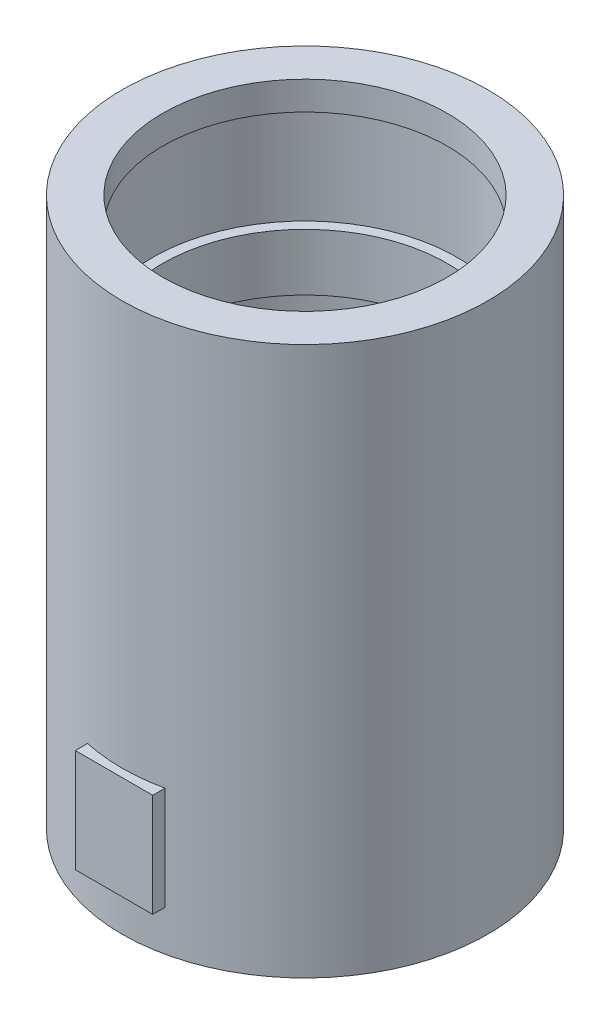
ISO-10303-21;
HEADER;
FILE_DESCRIPTION(('STEP AP214'),'2;1');
FILE_NAME('part.step','',(''),(''),'','','');
FILE_SCHEMA(('AUTOMOTIVE_DESIGN { 1 0 10303 214 1 1 1 1 }'));
ENDSEC;
DATA;
#1=APPLICATION_CONTEXT('core data for automotive mechanical design processes');
#2=APPLICATION_PROTOCOL_DEFINITION('international standard','automotive_design',2000,#1);
#3=PRODUCT_CONTEXT('',#1,'mechanical');
#4=PRODUCT('Part','Part','',(#3));
#5=PRODUCT_RELATED_PRODUCT_CATEGORY('part','',(#4));
#6=PRODUCT_DEFINITION_FORMATION('','',#4);
#7=PRODUCT_DEFINITION_CONTEXT('part definition',#1,'design');
#8=PRODUCT_DEFINITION('design','',#6,#7);
#9=PRODUCT_DEFINITION_SHAPE('','',#8);
#10=(LENGTH_UNIT() NAMED_UNIT(*) SI_UNIT(.MILLI.,.METRE.));
#11=(NAMED_UNIT(*) PLANE_ANGLE_UNIT() SI_UNIT($,.RADIAN.));
#12=(NAMED_UNIT(*) SI_UNIT($,.STERADIAN.) SOLID_ANGLE_UNIT());
#13=UNCERTAINTY_MEASURE_WITH_UNIT(LENGTH_MEASURE(1.E-05),#10,'distance_accuracy_value','');
#14=(GEOMETRIC_REPRESENTATION_CONTEXT(3) GLOBAL_UNCERTAINTY_ASSIGNED_CONTEXT((#13)) GLOBAL_UNIT_ASSIGNED_CONTEXT((#10,
#11,#12)) REPRESENTATION_CONTEXT('',''));
#15=CARTESIAN_POINT('',(0.,0.,0.));
#16=DIRECTION('',(0.,0.,1.));
#17=DIRECTION('',(1.,0.,0.));
#18=AXIS2_PLACEMENT_3D('',#15,#16,#17);
#19=CARTESIAN_POINT('',(0.,135.,0.));
#20=DIRECTION('',(0.,-1.,0.));
#21=DIRECTION('',(0.,0.,-1.));
#22=AXIS2_PLACEMENT_3D('',#19,#20,#21);
#23=CYLINDRICAL_SURFACE('',#22,45.);
#24=CARTESIAN_POINT('',(0.,10.,0.));
#25=DIRECTION('',(0.,-1.,0.));
#26=DIRECTION('',(1.,0.,0.));
#27=AXIS2_PLACEMENT_3D('',#24,#25,#26);
#28=CIRCLE('',#27,45.);
#29=CARTESIAN_POINT('',(9.525,10.,43.9803862534198));
#30=VERTEX_POINT('',#29);
#31=CARTESIAN_POINT('',(-9.525,10.,43.9803862534198));
#32=VERTEX_POINT('',#31);
#33=EDGE_CURVE('E145',#30,#32,#28,.T.);
#34=ORIENTED_EDGE('',*,*,#33,.T.);
#35=DIRECTION('',(0.,-1.,0.));
#36=VECTOR('',#35,1.);
#37=CARTESIAN_POINT('',(-9.525,135.,43.9803862534198));
#38=LINE('',#37,#36);
#39=CARTESIAN_POINT('',(-9.525,35.4,43.9803862534198));
#40=VERTEX_POINT('',#39);
#41=EDGE_CURVE('E11',#32,#40,#38,.F.);
#42=ORIENTED_EDGE('',*,*,#41,.T.);
#43=CARTESIAN_POINT('',(0.,35.4,0.));
#44=DIRECTION('',(0.,1.,0.));
#45=DIRECTION('',(0.,0.,1.));
#46=AXIS2_PLACEMENT_3D('',#43,#44,#45);
#47=CIRCLE('',#46,45.);
#48=CARTESIAN_POINT('',(9.525,35.4,43.9803862534198));
#49=VERTEX_POINT('',#48);
#50=EDGE_CURVE('E45',#40,#49,#47,.T.);
#51=ORIENTED_EDGE('',*,*,#50,.T.);
#52=DIRECTION('',(0.,-1.,0.));
#53=VECTOR('',#52,1.);
#54=CARTESIAN_POINT('',(9.525,135.,43.9803862534198));
#55=LINE('',#54,#53);
#56=EDGE_CURVE('E149',#49,#30,#55,.T.);
#57=ORIENTED_EDGE('',*,*,#56,.T.);
#58=EDGE_LOOP('',(#34,#42,#51,#57));
#59=FACE_BOUND('',#58,.T.);
#60=CARTESIAN_POINT('',(0.,135.,0.));
#61=DIRECTION('',(0.,1.,0.));
#62=DIRECTION('',(0.,0.,1.));
#63=AXIS2_PLACEMENT_3D('',#60,#61,#62);
#64=CIRCLE('',#63,45.);
#65=CARTESIAN_POINT('',(0.,135.,45.));
#66=VERTEX_POINT('',#65);
#67=EDGE_CURVE('E142',#66,#66,#64,.T.);
#68=ORIENTED_EDGE('',*,*,#67,.F.);
#69=EDGE_LOOP('',(#68));
#70=FACE_BOUND('',#69,.T.);
#71=CARTESIAN_POINT('',(0.,0.,0.));
#72=DIRECTION('',(0.,1.,0.));
#73=DIRECTION('',(0.,0.,1.));
#74=AXIS2_PLACEMENT_3D('',#71,#72,#73);
#75=CIRCLE('',#74,45.);
#76=CARTESIAN_POINT('',(0.,0.,45.));
#77=VERTEX_POINT('',#76);
#78=EDGE_CURVE('E139',#77,#77,#75,.T.);
#79=ORIENTED_EDGE('',*,*,#78,.T.);
#80=EDGE_LOOP('',(#79));
#81=FACE_BOUND('',#80,.T.);
#82=ADVANCED_FACE('F38',(#59,#70,#81),#23,.T.);
#83=CARTESIAN_POINT('',(0.,135.,0.));
#84=DIRECTION('',(0.,1.,0.));
#85=DIRECTION('',(0.,0.,1.));
#86=AXIS2_PLACEMENT_3D('',#83,#84,#85);
#87=PLANE('',#86);
#88=CARTESIAN_POINT('',(0.,135.,0.));
#89=DIRECTION('',(0.,1.,0.));
#90=DIRECTION('',(0.,0.,1.));
#91=AXIS2_PLACEMENT_3D('',#88,#89,#90);
#92=CIRCLE('',#91,35.);
#93=CARTESIAN_POINT('',(0.,135.,35.));
#94=VERTEX_POINT('',#93);
#95=EDGE_CURVE('E133',#94,#94,#92,.T.);
#96=ORIENTED_EDGE('',*,*,#95,.F.);
#97=EDGE_LOOP('',(#96));
#98=FACE_BOUND('',#97,.T.);
#99=ORIENTED_EDGE('',*,*,#67,.T.);
#100=EDGE_LOOP('',(#99));
#101=FACE_BOUND('',#100,.T.);
#102=ADVANCED_FACE('F166',(#98,#101),#87,.T.);
#103=CARTESIAN_POINT('',(0.,0.,0.));
#104=DIRECTION('',(0.,1.,0.));
#105=DIRECTION('',(0.,0.,1.));
#106=AXIS2_PLACEMENT_3D('',#103,#104,#105);
#107=PLANE('',#106);
#108=ORIENTED_EDGE('',*,*,#78,.F.);
#109=EDGE_LOOP('',(#108));
#110=FACE_BOUND('',#109,.T.);
#111=ADVANCED_FACE('F170',(#110),#107,.F.);
#112=CARTESIAN_POINT('',(0.,45.,0.));
#113=DIRECTION('',(0.,1.,0.));
#114=DIRECTION('',(0.,0.,1.));
#115=AXIS2_PLACEMENT_3D('',#112,#113,#114);
#116=CYLINDRICAL_SURFACE('',#115,35.);
#117=CARTESIAN_POINT('',(0.,128.,0.));
#118=DIRECTION('',(0.,1.,0.));
#119=DIRECTION('',(0.,0.,1.));
#120=AXIS2_PLACEMENT_3D('',#117,#118,#119);
#121=CIRCLE('',#120,35.);
#122=CARTESIAN_POINT('',(0.,128.,35.));
#123=VERTEX_POINT('',#122);
#124=EDGE_CURVE('E121',#123,#123,#121,.T.);
#125=CARTESIAN_POINT('',(0.,128.,35.));
#126=CARTESIAN_POINT('',(0.,128.072916666667,35.));
#127=CARTESIAN_POINT('',(0.,128.145833333333,35.));
#128=CARTESIAN_POINT('',(0.,128.291666666667,35.));
#129=CARTESIAN_POINT('',(0.,128.364583333333,35.));
#130=CARTESIAN_POINT('',(0.,128.510416666667,35.));
#131=CARTESIAN_POINT('',(0.,128.583333333333,35.));
#132=CARTESIAN_POINT('',(0.,128.729166666667,35.));
#133=CARTESIAN_POINT('',(0.,128.802083333333,35.));
#134=CARTESIAN_POINT('',(0.,128.947916666667,35.));
#135=CARTESIAN_POINT('',(0.,129.020833333333,35.));
#136=CARTESIAN_POINT('',(0.,129.166666666667,35.));
#137=CARTESIAN_POINT('',(0.,129.239583333333,35.));
#138=CARTESIAN_POINT('',(0.,129.385416666667,35.));
#139=CARTESIAN_POINT('',(0.,129.458333333333,35.));
#140=CARTESIAN_POINT('',(0.,129.604166666667,35.));
#141=CARTESIAN_POINT('',(0.,129.677083333333,35.));
#142=CARTESIAN_POINT('',(0.,129.822916666667,35.));
#143=CARTESIAN_POINT('',(0.,129.895833333333,35.));
#144=CARTESIAN_POINT('',(0.,130.041666666667,35.));
#145=CARTESIAN_POINT('',(0.,130.114583333333,35.));
#146=CARTESIAN_POINT('',(0.,130.260416666667,35.));
#147=CARTESIAN_POINT('',(0.,130.333333333333,35.));
#148=CARTESIAN_POINT('',(0.,130.479166666667,35.));
#149=CARTESIAN_POINT('',(0.,130.552083333333,35.));
#150=CARTESIAN_POINT('',(0.,130.697916666667,35.));
#151=CARTESIAN_POINT('',(0.,130.770833333333,35.));
#152=CARTESIAN_POINT('',(0.,130.916666666667,35.));
#153=CARTESIAN_POINT('',(0.,130.989583333333,35.));
#154=CARTESIAN_POINT('',(0.,131.135416666667,35.));
#155=CARTESIAN_POINT('',(0.,131.208333333333,35.));
#156=CARTESIAN_POINT('',(0.,131.354166666667,35.));
#157=CARTESIAN_POINT('',(0.,131.427083333333,35.));
#158=CARTESIAN_POINT('',(0.,131.572916666667,35.));
#159=CARTESIAN_POINT('',(0.,131.645833333333,35.));
#160=CARTESIAN_POINT('',(0.,131.791666666667,35.));
#161=CARTESIAN_POINT('',(0.,131.864583333333,35.));
#162=CARTESIAN_POINT('',(0.,132.010416666667,35.));
#163=CARTESIAN_POINT('',(0.,132.083333333333,35.));
#164=CARTESIAN_POINT('',(0.,132.229166666667,35.));
#165=CARTESIAN_POINT('',(0.,132.302083333333,35.));
#166=CARTESIAN_POINT('',(0.,132.447916666667,35.));
#167=CARTESIAN_POINT('',(0.,132.520833333333,35.));
#168=CARTESIAN_POINT('',(0.,132.666666666667,35.));
#169=CARTESIAN_POINT('',(0.,132.739583333333,35.));
#170=CARTESIAN_POINT('',(0.,132.885416666667,35.));
#171=CARTESIAN_POINT('',(0.,132.958333333333,35.));
#172=CARTESIAN_POINT('',(0.,133.104166666667,35.));
#173=CARTESIAN_POINT('',(0.,133.177083333333,35.));
#174=CARTESIAN_POINT('',(0.,133.322916666667,35.));
#175=CARTESIAN_POINT('',(0.,133.395833333333,35.));
#176=CARTESIAN_POINT('',(0.,133.541666666667,35.));
#177=CARTESIAN_POINT('',(0.,133.614583333333,35.));
#178=CARTESIAN_POINT('',(0.,133.760416666667,35.));
#179=CARTESIAN_POINT('',(0.,133.833333333333,35.));
#180=CARTESIAN_POINT('',(0.,133.979166666667,35.));
#181=CARTESIAN_POINT('',(0.,134.052083333333,35.));
#182=CARTESIAN_POINT('',(0.,134.197916666667,35.));
#183=CARTESIAN_POINT('',(0.,134.270833333333,35.));
#184=CARTESIAN_POINT('',(0.,134.416666666667,35.));
#185=CARTESIAN_POINT('',(0.,134.489583333333,35.));
#186=CARTESIAN_POINT('',(0.,134.635416666667,35.));
#187=CARTESIAN_POINT('',(0.,134.708333333333,35.));
#188=CARTESIAN_POINT('',(0.,134.854166666667,35.));
#189=CARTESIAN_POINT('',(0.,134.927083333333,35.));
#190=CARTESIAN_POINT('',(0.,135.,35.));
#191=B_SPLINE_CURVE_WITH_KNOTS('',3,(#125,#126,#127,#128,#129,#130,#131,#132,#133,#134,#135,
#136,#137,#138,#139,#140,#141,#142,#143,#144,#145,#146,#147,#148,#149,#150,#151,#152,#153,#154,
#155,#156,#157,#158,#159,#160,#161,#162,#163,#164,#165,#166,#167,#168,#169,#170,#171,#172,#173,
#174,#175,#176,#177,#178,#179,#180,#181,#182,#183,#184,#185,#186,#187,#188,#189,#190),
.UNSPECIFIED.,.F.,.F.,(4,2,2,2,2,2,2,2,2,2,2,2,2,2,2,2,2,2,2,2,2,2,2,2,2,2,2,2,2,2,2,2,4),(0.,
0.21874999999999,0.43749999999998,0.656249999999969,0.874999999999987,1.09375,1.31249999999999,
1.53124999999998,1.74999999999997,1.96874999999999,2.18750000000001,2.40625,2.62499999999999,
2.84374999999998,3.06249999999997,3.28124999999999,3.5,3.71874999999999,3.93749999999998,
4.15624999999997,4.37499999999999,4.59375000000001,4.8125,5.03124999999999,5.24999999999998,
5.46874999999999,5.68750000000001,5.90625,6.12499999999999,6.34374999999998,6.56249999999997,
6.78124999999999,7.00000000000001),.UNSPECIFIED.);
#192=EDGE_CURVE('BSEAM176',#123,#94,#191,.T.);
#193=ORIENTED_EDGE('',*,*,#124,.F.);
#194=ORIENTED_EDGE('',*,*,#95,.T.);
#195=ORIENTED_EDGE('',*,*,#192,.T.);
#196=ORIENTED_EDGE('',*,*,#192,.F.);
#197=EDGE_LOOP('',(#193,#195,#194,#196));
#198=FACE_BOUND('',#197,.T.);
#199=ADVANCED_FACE('F176',(#198),#116,.F.);
#200=CARTESIAN_POINT('',(0.,103.,0.));
#201=DIRECTION('',(0.,1.,0.));
#202=DIRECTION('',(0.,0.,1.));
#203=AXIS2_PLACEMENT_3D('',#200,#201,#202);
#204=CYLINDRICAL_SURFACE('',#203,37.5);
#205=CARTESIAN_POINT('',(0.,103.,0.));
#206=DIRECTION('',(0.,1.,0.));
#207=DIRECTION('',(0.,0.,1.));
#208=AXIS2_PLACEMENT_3D('',#205,#206,#207);
#209=CIRCLE('',#208,37.5);
#210=CARTESIAN_POINT('',(0.,103.,37.5));
#211=VERTEX_POINT('',#210);
#212=EDGE_CURVE('E130',#211,#211,#209,.T.);
#213=ORIENTED_EDGE('',*,*,#212,.F.);
#214=EDGE_LOOP('',(#213));
#215=FACE_BOUND('',#214,.T.);
#216=CARTESIAN_POINT('',(0.,128.,0.));
#217=DIRECTION('',(0.,1.,0.));
#218=DIRECTION('',(0.,0.,1.));
#219=AXIS2_PLACEMENT_3D('',#216,#217,#218);
#220=CIRCLE('',#219,37.5);
#221=CARTESIAN_POINT('',(0.,128.,37.5));
#222=VERTEX_POINT('',#221);
#223=EDGE_CURVE('E127',#222,#222,#220,.T.);
#224=ORIENTED_EDGE('',*,*,#223,.T.);
#225=EDGE_LOOP('',(#224));
#226=FACE_BOUND('',#225,.T.);
#227=ADVANCED_FACE('F183',(#215,#226),#204,.F.);
#228=CARTESIAN_POINT('',(0.,103.,0.));
#229=DIRECTION('',(0.,1.,0.));
#230=DIRECTION('',(0.,0.,1.));
#231=AXIS2_PLACEMENT_3D('',#228,#229,#230);
#232=PLANE('',#231);
#233=CARTESIAN_POINT('',(0.,103.,0.));
#234=DIRECTION('',(0.,1.,0.));
#235=DIRECTION('',(0.,0.,1.));
#236=AXIS2_PLACEMENT_3D('',#233,#234,#235);
#237=CIRCLE('',#236,35.);
#238=CARTESIAN_POINT('',(0.,103.,35.));
#239=VERTEX_POINT('',#238);
#240=EDGE_CURVE('E124',#239,#239,#237,.T.);
#241=ORIENTED_EDGE('',*,*,#240,.F.);
#242=EDGE_LOOP('',(#241));
#243=FACE_BOUND('',#242,.T.);
#244=ORIENTED_EDGE('',*,*,#212,.T.);
#245=EDGE_LOOP('',(#244));
#246=FACE_BOUND('',#245,.T.);
#247=ADVANCED_FACE('F194',(#243,#246),#232,.T.);
#248=CARTESIAN_POINT('',(0.,128.,0.));
#249=DIRECTION('',(0.,1.,0.));
#250=DIRECTION('',(0.,0.,1.));
#251=AXIS2_PLACEMENT_3D('',#248,#249,#250);
#252=PLANE('',#251);
#253=ORIENTED_EDGE('',*,*,#124,.T.);
#254=EDGE_LOOP('',(#253));
#255=FACE_BOUND('',#254,.T.);
#256=ORIENTED_EDGE('',*,*,#223,.F.);
#257=EDGE_LOOP('',(#256));
#258=FACE_BOUND('',#257,.T.);
#259=ADVANCED_FACE('F196',(#255,#258),#252,.F.);
#260=CARTESIAN_POINT('',(0.,89.,0.));
#261=DIRECTION('',(0.,1.,0.));
#262=DIRECTION('',(0.,0.,1.));
#263=AXIS2_PLACEMENT_3D('',#260,#261,#262);
#264=CIRCLE('',#263,35.);
#265=CARTESIAN_POINT('',(0.,89.,35.));
#266=VERTEX_POINT('',#265);
#267=EDGE_CURVE('E109',#266,#266,#264,.T.);
#268=CARTESIAN_POINT('',(0.,89.,35.));
#269=CARTESIAN_POINT('',(0.,89.1458333333333,35.));
#270=CARTESIAN_POINT('',(0.,89.2916666666667,35.));
#271=CARTESIAN_POINT('',(0.,89.5833333333333,35.));
#272=CARTESIAN_POINT('',(0.,89.7291666666667,35.));
#273=CARTESIAN_POINT('',(0.,90.0208333333333,35.));
#274=CARTESIAN_POINT('',(0.,90.1666666666667,35.));
#275=CARTESIAN_POINT('',(0.,90.4583333333333,35.));
#276=CARTESIAN_POINT('',(0.,90.6041666666667,35.));
#277=CARTESIAN_POINT('',(0.,90.8958333333333,35.));
#278=CARTESIAN_POINT('',(0.,91.0416666666667,35.));
#279=CARTESIAN_POINT('',(0.,91.3333333333333,35.));
#280=CARTESIAN_POINT('',(0.,91.4791666666667,35.));
#281=CARTESIAN_POINT('',(0.,91.7708333333333,35.));
#282=CARTESIAN_POINT('',(0.,91.9166666666667,35.));
#283=CARTESIAN_POINT('',(0.,92.2083333333333,35.));
#284=CARTESIAN_POINT('',(0.,92.3541666666667,35.));
#285=CARTESIAN_POINT('',(0.,92.6458333333333,35.));
#286=CARTESIAN_POINT('',(0.,92.7916666666667,35.));
#287=CARTESIAN_POINT('',(0.,93.0833333333333,35.));
#288=CARTESIAN_POINT('',(0.,93.2291666666667,35.));
#289=CARTESIAN_POINT('',(0.,93.5208333333333,35.));
#290=CARTESIAN_POINT('',(0.,93.6666666666667,35.));
#291=CARTESIAN_POINT('',(0.,93.9583333333333,35.));
#292=CARTESIAN_POINT('',(0.,94.1041666666667,35.));
#293=CARTESIAN_POINT('',(0.,94.3958333333333,35.));
#294=CARTESIAN_POINT('',(0.,94.5416666666667,35.));
#295=CARTESIAN_POINT('',(0.,94.8333333333333,35.));
#296=CARTESIAN_POINT('',(0.,94.9791666666667,35.));
#297=CARTESIAN_POINT('',(0.,95.2708333333333,35.));
#298=CARTESIAN_POINT('',(0.,95.4166666666667,35.));
#299=CARTESIAN_POINT('',(0.,95.7083333333333,35.));
#300=CARTESIAN_POINT('',(0.,95.8541666666667,35.));
#301=CARTESIAN_POINT('',(0.,96.1458333333333,35.));
#302=CARTESIAN_POINT('',(0.,96.2916666666667,35.));
#303=CARTESIAN_POINT('',(0.,96.5833333333333,35.));
#304=CARTESIAN_POINT('',(0.,96.7291666666667,35.));
#305=CARTESIAN_POINT('',(0.,97.0208333333333,35.));
#306=CARTESIAN_POINT('',(0.,97.1666666666667,35.));
#307=CARTESIAN_POINT('',(0.,97.4583333333333,35.));
#308=CARTESIAN_POINT('',(0.,97.6041666666667,35.));
#309=CARTESIAN_POINT('',(0.,97.8958333333333,35.));
#310=CARTESIAN_POINT('',(0.,98.0416666666667,35.));
#311=CARTESIAN_POINT('',(0.,98.3333333333333,35.));
#312=CARTESIAN_POINT('',(0.,98.4791666666667,35.));
#313=CARTESIAN_POINT('',(0.,98.7708333333333,35.));
#314=CARTESIAN_POINT('',(0.,98.9166666666667,35.));
#315=CARTESIAN_POINT('',(0.,99.2083333333333,35.));
#316=CARTESIAN_POINT('',(0.,99.3541666666667,35.));
#317=CARTESIAN_POINT('',(0.,99.6458333333333,35.));
#318=CARTESIAN_POINT('',(0.,99.7916666666667,35.));
#319=CARTESIAN_POINT('',(0.,100.083333333333,35.));
#320=CARTESIAN_POINT('',(0.,100.229166666667,35.));
#321=CARTESIAN_POINT('',(0.,100.520833333333,35.));
#322=CARTESIAN_POINT('',(0.,100.666666666667,35.));
#323=CARTESIAN_POINT('',(0.,100.958333333333,35.));
#324=CARTESIAN_POINT('',(0.,101.104166666667,35.));
#325=CARTESIAN_POINT('',(0.,101.395833333333,35.));
#326=CARTESIAN_POINT('',(0.,101.541666666667,35.));
#327=CARTESIAN_POINT('',(0.,101.833333333333,35.));
#328=CARTESIAN_POINT('',(0.,101.979166666667,35.));
#329=CARTESIAN_POINT('',(0.,102.270833333333,35.));
#330=CARTESIAN_POINT('',(0.,102.416666666667,35.));
#331=CARTESIAN_POINT('',(0.,102.708333333333,35.));
#332=CARTESIAN_POINT('',(0.,102.854166666667,35.));
#333=CARTESIAN_POINT('',(0.,103.,35.));
#334=B_SPLINE_CURVE_WITH_KNOTS('',3,(#268,#269,#270,#271,#272,#273,#274,#275,#276,#277,#278,
#279,#280,#281,#282,#283,#284,#285,#286,#287,#288,#289,#290,#291,#292,#293,#294,#295,#296,#297,
#298,#299,#300,#301,#302,#303,#304,#305,#306,#307,#308,#309,#310,#311,#312,#313,#314,#315,#316,
#317,#318,#319,#320,#321,#322,#323,#324,#325,#326,#327,#328,#329,#330,#331,#332,#333),
.UNSPECIFIED.,.F.,.F.,(4,2,2,2,2,2,2,2,2,2,2,2,2,2,2,2,2,2,2,2,2,2,2,2,2,2,2,2,2,2,2,2,4),(0.,
0.437500000000007,0.875000000000015,1.31250000000001,1.75,2.18750000000001,2.62500000000002,
3.06250000000001,3.5,3.93750000000001,4.375,4.8125,5.25,5.68750000000001,6.12500000000001,
6.5625,7.00000000000001,7.43750000000001,7.87500000000001,8.3125,8.75000000000001,
9.18750000000001,9.62499999999999,10.0625,10.5,10.9375,11.375,11.8125,12.25,12.6875,13.125,
13.5625,14.),.UNSPECIFIED.);
#335=EDGE_CURVE('BSEAM186',#266,#239,#334,.T.);
#336=ORIENTED_EDGE('',*,*,#267,.F.);
#337=ORIENTED_EDGE('',*,*,#240,.T.);
#338=ORIENTED_EDGE('',*,*,#335,.T.);
#339=ORIENTED_EDGE('',*,*,#335,.F.);
#340=EDGE_LOOP('',(#336,#338,#337,#339));
#341=FACE_BOUND('',#340,.T.);
#342=ADVANCED_FACE('F186',(#341),#116,.F.);
#343=CARTESIAN_POINT('',(0.,64.,0.));
#344=DIRECTION('',(0.,1.,0.));
#345=DIRECTION('',(0.,0.,1.));
#346=AXIS2_PLACEMENT_3D('',#343,#344,#345);
#347=CYLINDRICAL_SURFACE('',#346,37.5);
#348=CARTESIAN_POINT('',(0.,64.,0.));
#349=DIRECTION('',(0.,1.,0.));
#350=DIRECTION('',(0.,0.,1.));
#351=AXIS2_PLACEMENT_3D('',#348,#349,#350);
#352=CIRCLE('',#351,37.5);
#353=CARTESIAN_POINT('',(0.,64.,37.5));
#354=VERTEX_POINT('',#353);
#355=EDGE_CURVE('E118',#354,#354,#352,.T.);
#356=ORIENTED_EDGE('',*,*,#355,.F.);
#357=EDGE_LOOP('',(#356));
#358=FACE_BOUND('',#357,.T.);
#359=CARTESIAN_POINT('',(0.,89.,0.));
#360=DIRECTION('',(0.,1.,0.));
#361=DIRECTION('',(0.,0.,1.));
#362=AXIS2_PLACEMENT_3D('',#359,#360,#361);
#363=CIRCLE('',#362,37.5);
#364=CARTESIAN_POINT('',(0.,89.,37.5));
#365=VERTEX_POINT('',#364);
#366=EDGE_CURVE('E115',#365,#365,#363,.T.);
#367=ORIENTED_EDGE('',*,*,#366,.T.);
#368=EDGE_LOOP('',(#367));
#369=FACE_BOUND('',#368,.T.);
#370=ADVANCED_FACE('F203',(#358,#369),#347,.F.);
#371=CARTESIAN_POINT('',(0.,64.,0.));
#372=DIRECTION('',(0.,1.,0.));
#373=DIRECTION('',(0.,0.,1.));
#374=AXIS2_PLACEMENT_3D('',#371,#372,#373);
#375=PLANE('',#374);
#376=CARTESIAN_POINT('',(0.,64.,0.));
#377=DIRECTION('',(0.,1.,0.));
#378=DIRECTION('',(0.,0.,1.));
#379=AXIS2_PLACEMENT_3D('',#376,#377,#378);
#380=CIRCLE('',#379,35.);
#381=CARTESIAN_POINT('',(0.,64.,35.));
#382=VERTEX_POINT('',#381);
#383=EDGE_CURVE('E112',#382,#382,#380,.T.);
#384=ORIENTED_EDGE('',*,*,#383,.F.);
#385=EDGE_LOOP('',(#384));
#386=FACE_BOUND('',#385,.T.);
#387=ORIENTED_EDGE('',*,*,#355,.T.);
#388=EDGE_LOOP('',(#387));
#389=FACE_BOUND('',#388,.T.);
#390=ADVANCED_FACE('F206',(#386,#389),#375,.T.);
#391=CARTESIAN_POINT('',(0.,89.,0.));
#392=DIRECTION('',(0.,1.,0.));
#393=DIRECTION('',(0.,0.,1.));
#394=AXIS2_PLACEMENT_3D('',#391,#392,#393);
#395=PLANE('',#394);
#396=ORIENTED_EDGE('',*,*,#267,.T.);
#397=EDGE_LOOP('',(#396));
#398=FACE_BOUND('',#397,.T.);
#399=ORIENTED_EDGE('',*,*,#366,.F.);
#400=EDGE_LOOP('',(#399));
#401=FACE_BOUND('',#400,.T.);
#402=ADVANCED_FACE('F190',(#398,#401),#395,.F.);
#403=CARTESIAN_POINT('',(0.,45.,0.));
#404=DIRECTION('',(0.,1.,0.));
#405=DIRECTION('',(0.,0.,1.));
#406=AXIS2_PLACEMENT_3D('',#403,#404,#405);
#407=PLANE('',#406);
#408=CARTESIAN_POINT('',(0.,45.,0.));
#409=DIRECTION('',(0.,1.,0.));
#410=DIRECTION('',(0.,0.,1.));
#411=AXIS2_PLACEMENT_3D('',#408,#409,#410);
#412=CIRCLE('',#411,7.5);
#413=CARTESIAN_POINT('',(0.,45.,7.5));
#414=VERTEX_POINT('',#413);
#415=EDGE_CURVE('E102',#414,#414,#412,.T.);
#416=ORIENTED_EDGE('',*,*,#415,.F.);
#417=EDGE_LOOP('',(#416));
#418=FACE_BOUND('',#417,.T.);
#419=CARTESIAN_POINT('',(0.,45.,0.));
#420=DIRECTION('',(0.,1.,0.));
#421=DIRECTION('',(0.,0.,1.));
#422=AXIS2_PLACEMENT_3D('',#419,#420,#421);
#423=CIRCLE('',#422,35.);
#424=CARTESIAN_POINT('',(0.,45.,35.));
#425=VERTEX_POINT('',#424);
#426=EDGE_CURVE('E136',#425,#425,#423,.T.);
#427=ORIENTED_EDGE('',*,*,#426,.T.);
#428=EDGE_LOOP('',(#427));
#429=FACE_BOUND('',#428,.T.);
#430=ADVANCED_FACE('F187',(#418,#429),#407,.T.);
#431=CARTESIAN_POINT('',(0.,45.,35.));
#432=CARTESIAN_POINT('',(0.,45.1979166666667,35.));
#433=CARTESIAN_POINT('',(0.,45.3958333333333,35.));
#434=CARTESIAN_POINT('',(0.,45.7916666666667,35.));
#435=CARTESIAN_POINT('',(0.,45.9895833333333,35.));
#436=CARTESIAN_POINT('',(0.,46.3854166666667,35.));
#437=CARTESIAN_POINT('',(0.,46.5833333333333,35.));
#438=CARTESIAN_POINT('',(0.,46.9791666666667,35.));
#439=CARTESIAN_POINT('',(0.,47.1770833333333,35.));
#440=CARTESIAN_POINT('',(0.,47.5729166666667,35.));
#441=CARTESIAN_POINT('',(0.,47.7708333333333,35.));
#442=CARTESIAN_POINT('',(0.,48.1666666666667,35.));
#443=CARTESIAN_POINT('',(0.,48.3645833333333,35.));
#444=CARTESIAN_POINT('',(0.,48.7604166666667,35.));
#445=CARTESIAN_POINT('',(0.,48.9583333333333,35.));
#446=CARTESIAN_POINT('',(0.,49.3541666666667,35.));
#447=CARTESIAN_POINT('',(0.,49.5520833333333,35.));
#448=CARTESIAN_POINT('',(0.,49.9479166666667,35.));
#449=CARTESIAN_POINT('',(0.,50.1458333333333,35.));
#450=CARTESIAN_POINT('',(0.,50.5416666666667,35.));
#451=CARTESIAN_POINT('',(0.,50.7395833333333,35.));
#452=CARTESIAN_POINT('',(0.,51.1354166666667,35.));
#453=CARTESIAN_POINT('',(0.,51.3333333333333,35.));
#454=CARTESIAN_POINT('',(0.,51.7291666666667,35.));
#455=CARTESIAN_POINT('',(0.,51.9270833333333,35.));
#456=CARTESIAN_POINT('',(0.,52.3229166666667,35.));
#457=CARTESIAN_POINT('',(0.,52.5208333333333,35.));
#458=CARTESIAN_POINT('',(0.,52.9166666666667,35.));
#459=CARTESIAN_POINT('',(0.,53.1145833333333,35.));
#460=CARTESIAN_POINT('',(0.,53.5104166666667,35.));
#461=CARTESIAN_POINT('',(0.,53.7083333333333,35.));
#462=CARTESIAN_POINT('',(0.,54.1041666666667,35.));
#463=CARTESIAN_POINT('',(0.,54.3020833333333,35.));
#464=CARTESIAN_POINT('',(0.,54.6979166666667,35.));
#465=CARTESIAN_POINT('',(0.,54.8958333333333,35.));
#466=CARTESIAN_POINT('',(0.,55.2916666666667,35.));
#467=CARTESIAN_POINT('',(0.,55.4895833333333,35.));
#468=CARTESIAN_POINT('',(0.,55.8854166666667,35.));
#469=CARTESIAN_POINT('',(0.,56.0833333333333,35.));
#470=CARTESIAN_POINT('',(0.,56.4791666666667,35.));
#471=CARTESIAN_POINT('',(0.,56.6770833333333,35.));
#472=CARTESIAN_POINT('',(0.,57.0729166666667,35.));
#473=CARTESIAN_POINT('',(0.,57.2708333333333,35.));
#474=CARTESIAN_POINT('',(0.,57.6666666666667,35.));
#475=CARTESIAN_POINT('',(0.,57.8645833333333,35.));
#476=CARTESIAN_POINT('',(0.,58.2604166666667,35.));
#477=CARTESIAN_POINT('',(0.,58.4583333333333,35.));
#478=CARTESIAN_POINT('',(0.,58.8541666666667,35.));
#479=CARTESIAN_POINT('',(0.,59.0520833333333,35.));
#480=CARTESIAN_POINT('',(0.,59.4479166666667,35.));
#481=CARTESIAN_POINT('',(0.,59.6458333333333,35.));
#482=CARTESIAN_POINT('',(0.,60.0416666666667,35.));
#483=CARTESIAN_POINT('',(0.,60.2395833333333,35.));
#484=CARTESIAN_POINT('',(0.,60.6354166666667,35.));
#485=CARTESIAN_POINT('',(0.,60.8333333333333,35.));
#486=CARTESIAN_POINT('',(0.,61.2291666666667,35.));
#487=CARTESIAN_POINT('',(0.,61.4270833333333,35.));
#488=CARTESIAN_POINT('',(0.,61.8229166666667,35.));
#489=CARTESIAN_POINT('',(0.,62.0208333333333,35.));
#490=CARTESIAN_POINT('',(0.,62.4166666666667,35.));
#491=CARTESIAN_POINT('',(0.,62.6145833333333,35.));
#492=CARTESIAN_POINT('',(0.,63.0104166666667,35.));
#493=CARTESIAN_POINT('',(0.,63.2083333333333,35.));
#494=CARTESIAN_POINT('',(0.,63.6041666666667,35.));
#495=CARTESIAN_POINT('',(0.,63.8020833333333,35.));
#496=CARTESIAN_POINT('',(0.,64.,35.));
#497=B_SPLINE_CURVE_WITH_KNOTS('',3,(#431,#432,#433,#434,#435,#436,#437,#438,#439,#440,#441,
#442,#443,#444,#445,#446,#447,#448,#449,#450,#451,#452,#453,#454,#455,#456,#457,#458,#459,#460,
#461,#462,#463,#464,#465,#466,#467,#468,#469,#470,#471,#472,#473,#474,#475,#476,#477,#478,#479,
#480,#481,#482,#483,#484,#485,#486,#487,#488,#489,#490,#491,#492,#493,#494,#495,#496),
.UNSPECIFIED.,.F.,.F.,(4,2,2,2,2,2,2,2,2,2,2,2,2,2,2,2,2,2,2,2,2,2,2,2,2,2,2,2,2,2,2,2,4),(0.,
0.593749999999997,1.18749999999999,1.78125,2.375,2.96874999999999,3.5625,4.15624999999999,
4.74999999999999,5.34374999999999,5.93749999999999,6.53124999999999,7.12499999999999,
7.71874999999999,8.31249999999999,8.90624999999999,9.49999999999999,10.09375,10.6875,11.28125,
11.875,12.46875,13.0625,13.65625,14.25,14.84375,15.4375,16.03125,16.625,17.21875,17.8125,
18.40625,19.),.UNSPECIFIED.);
#498=EDGE_CURVE('BSEAM185',#425,#382,#497,.T.);
#499=ORIENTED_EDGE('',*,*,#426,.F.);
#500=ORIENTED_EDGE('',*,*,#383,.T.);
#501=ORIENTED_EDGE('',*,*,#498,.T.);
#502=ORIENTED_EDGE('',*,*,#498,.F.);
#503=EDGE_LOOP('',(#499,#501,#500,#502));
#504=FACE_BOUND('',#503,.T.);
#505=ADVANCED_FACE('F185',(#504),#116,.F.);
#506=CARTESIAN_POINT('',(0.,40.,0.));
#507=DIRECTION('',(0.,1.,0.));
#508=DIRECTION('',(0.,0.,1.));
#509=AXIS2_PLACEMENT_3D('',#506,#507,#508);
#510=CYLINDRICAL_SURFACE('',#509,7.5);
#511=CARTESIAN_POINT('',(0.,40.,0.));
#512=DIRECTION('',(0.,1.,0.));
#513=DIRECTION('',(0.,0.,1.));
#514=AXIS2_PLACEMENT_3D('',#511,#512,#513);
#515=CIRCLE('',#514,7.5);
#516=CARTESIAN_POINT('',(0.,40.,7.5));
#517=VERTEX_POINT('',#516);
#518=EDGE_CURVE('E106',#517,#517,#515,.T.);
#519=ORIENTED_EDGE('',*,*,#518,.F.);
#520=EDGE_LOOP('',(#519));
#521=FACE_BOUND('',#520,.T.);
#522=ORIENTED_EDGE('',*,*,#415,.T.);
#523=EDGE_LOOP('',(#522));
#524=FACE_BOUND('',#523,.T.);
#525=ADVANCED_FACE('F214',(#521,#524),#510,.F.);
#526=CARTESIAN_POINT('',(0.,40.,0.));
#527=DIRECTION('',(0.,1.,0.));
#528=DIRECTION('',(0.,0.,1.));
#529=AXIS2_PLACEMENT_3D('',#526,#527,#528);
#530=PLANE('',#529);
#531=ORIENTED_EDGE('',*,*,#518,.T.);
#532=EDGE_LOOP('',(#531));
#533=FACE_BOUND('',#532,.T.);
#534=ADVANCED_FACE('F217',(#533),#530,.T.);
#535=CARTESIAN_POINT('',(-9.525,35.4,41.));
#536=DIRECTION('',(-1.,0.,0.));
#537=DIRECTION('',(0.,0.,1.));
#538=AXIS2_PLACEMENT_3D('',#535,#536,#537);
#539=PLANE('',#538);
#540=ORIENTED_EDGE('',*,*,#41,.F.);
#541=DIRECTION('',(0.,0.,1.));
#542=VECTOR('',#541,1.);
#543=CARTESIAN_POINT('',(-9.525,10.,41.));
#544=LINE('',#543,#542);
#545=CARTESIAN_POINT('',(-9.525,10.,47.));
#546=VERTEX_POINT('',#545);
#547=EDGE_CURVE('E52',#32,#546,#544,.T.);
#548=ORIENTED_EDGE('',*,*,#547,.T.);
#549=DIRECTION('',(0.,-1.,0.));
#550=VECTOR('',#549,1.);
#551=CARTESIAN_POINT('',(-9.525,35.4,47.));
#552=LINE('',#551,#550);
#553=CARTESIAN_POINT('',(-9.525,35.4,47.));
#554=VERTEX_POINT('',#553);
#555=EDGE_CURVE('E79',#554,#546,#552,.T.);
#556=ORIENTED_EDGE('',*,*,#555,.F.);
#557=DIRECTION('',(0.,0.,1.));
#558=VECTOR('',#557,1.);
#559=CARTESIAN_POINT('',(-9.525,35.4,41.));
#560=LINE('',#559,#558);
#561=EDGE_CURVE('E100',#40,#554,#560,.T.);
#562=ORIENTED_EDGE('',*,*,#561,.F.);
#563=EDGE_LOOP('',(#540,#548,#556,#562));
#564=FACE_BOUND('',#563,.T.);
#565=ADVANCED_FACE('F77',(#564),#539,.T.);
#566=CARTESIAN_POINT('',(9.525,35.4,41.));
#567=DIRECTION('',(1.,0.,0.));
#568=DIRECTION('',(0.,0.,-1.));
#569=AXIS2_PLACEMENT_3D('',#566,#567,#568);
#570=PLANE('',#569);
#571=ORIENTED_EDGE('',*,*,#56,.F.);
#572=DIRECTION('',(0.,0.,1.));
#573=VECTOR('',#572,1.);
#574=CARTESIAN_POINT('',(9.525,35.4,41.));
#575=LINE('',#574,#573);
#576=CARTESIAN_POINT('',(9.525,35.4,47.));
#577=VERTEX_POINT('',#576);
#578=EDGE_CURVE('E103',#49,#577,#575,.T.);
#579=ORIENTED_EDGE('',*,*,#578,.T.);
#580=DIRECTION('',(0.,1.,0.));
#581=VECTOR('',#580,1.);
#582=CARTESIAN_POINT('',(9.525,35.4,47.));
#583=LINE('',#582,#581);
#584=CARTESIAN_POINT('',(9.525,10.,47.));
#585=VERTEX_POINT('',#584);
#586=EDGE_CURVE('E91',#585,#577,#583,.T.);
#587=ORIENTED_EDGE('',*,*,#586,.F.);
#588=DIRECTION('',(0.,0.,1.));
#589=VECTOR('',#588,1.);
#590=CARTESIAN_POINT('',(9.525,10.,41.));
#591=LINE('',#590,#589);
#592=EDGE_CURVE('E81',#30,#585,#591,.T.);
#593=ORIENTED_EDGE('',*,*,#592,.F.);
#594=EDGE_LOOP('',(#571,#579,#587,#593));
#595=FACE_BOUND('',#594,.T.);
#596=ADVANCED_FACE('F154',(#595),#570,.T.);
#597=CARTESIAN_POINT('',(-9.525,35.4,41.));
#598=DIRECTION('',(0.,1.,0.));
#599=DIRECTION('',(0.,0.,1.));
#600=AXIS2_PLACEMENT_3D('',#597,#598,#599);
#601=PLANE('',#600);
#602=ORIENTED_EDGE('',*,*,#50,.F.);
#603=ORIENTED_EDGE('',*,*,#561,.T.);
#604=DIRECTION('',(-1.,0.,0.));
#605=VECTOR('',#604,1.);
#606=CARTESIAN_POINT('',(-9.525,35.4,47.));
#607=LINE('',#606,#605);
#608=EDGE_CURVE('E82',#577,#554,#607,.T.);
#609=ORIENTED_EDGE('',*,*,#608,.F.);
#610=ORIENTED_EDGE('',*,*,#578,.F.);
#611=EDGE_LOOP('',(#602,#603,#609,#610));
#612=FACE_BOUND('',#611,.T.);
#613=ADVANCED_FACE('F155',(#612),#601,.T.);
#614=CARTESIAN_POINT('',(-9.525,10.,41.));
#615=DIRECTION('',(0.,-1.,0.));
#616=DIRECTION('',(1.,0.,0.));
#617=AXIS2_PLACEMENT_3D('',#614,#615,#616);
#618=PLANE('',#617);
#619=ORIENTED_EDGE('',*,*,#33,.F.);
#620=ORIENTED_EDGE('',*,*,#592,.T.);
#621=DIRECTION('',(1.,0.,0.));
#622=VECTOR('',#621,1.);
#623=CARTESIAN_POINT('',(-9.525,10.,47.));
#624=LINE('',#623,#622);
#625=EDGE_CURVE('E85',#546,#585,#624,.T.);
#626=ORIENTED_EDGE('',*,*,#625,.F.);
#627=ORIENTED_EDGE('',*,*,#547,.F.);
#628=EDGE_LOOP('',(#619,#620,#626,#627));
#629=FACE_BOUND('',#628,.T.);
#630=ADVANCED_FACE('F86',(#629),#618,.T.);
#631=CARTESIAN_POINT('',(0.,0.,47.));
#632=DIRECTION('',(0.,0.,1.));
#633=DIRECTION('',(1.,0.,0.));
#634=AXIS2_PLACEMENT_3D('',#631,#632,#633);
#635=PLANE('',#634);
#636=ORIENTED_EDGE('',*,*,#555,.T.);
#637=ORIENTED_EDGE('',*,*,#625,.T.);
#638=ORIENTED_EDGE('',*,*,#586,.T.);
#639=ORIENTED_EDGE('',*,*,#608,.T.);
#640=EDGE_LOOP('',(#636,#637,#638,#639));
#641=FACE_BOUND('',#640,.T.);
#642=ADVANCED_FACE('F94',(#641),#635,.T.);
#643=CLOSED_SHELL('',(#82,#102,#111,#199,#227,#247,#259,#342,#370,#390,#402,#430,#505,#525,#534,
#565,#596,#613,#630,#642));
#644=MANIFOLD_SOLID_BREP('B2',#643);
#645=ADVANCED_BREP_SHAPE_REPRESENTATION('',(#18,#644),#14);
#646=SHAPE_DEFINITION_REPRESENTATION(#9,#645);
ENDSEC;
END-ISO-10303-21;
